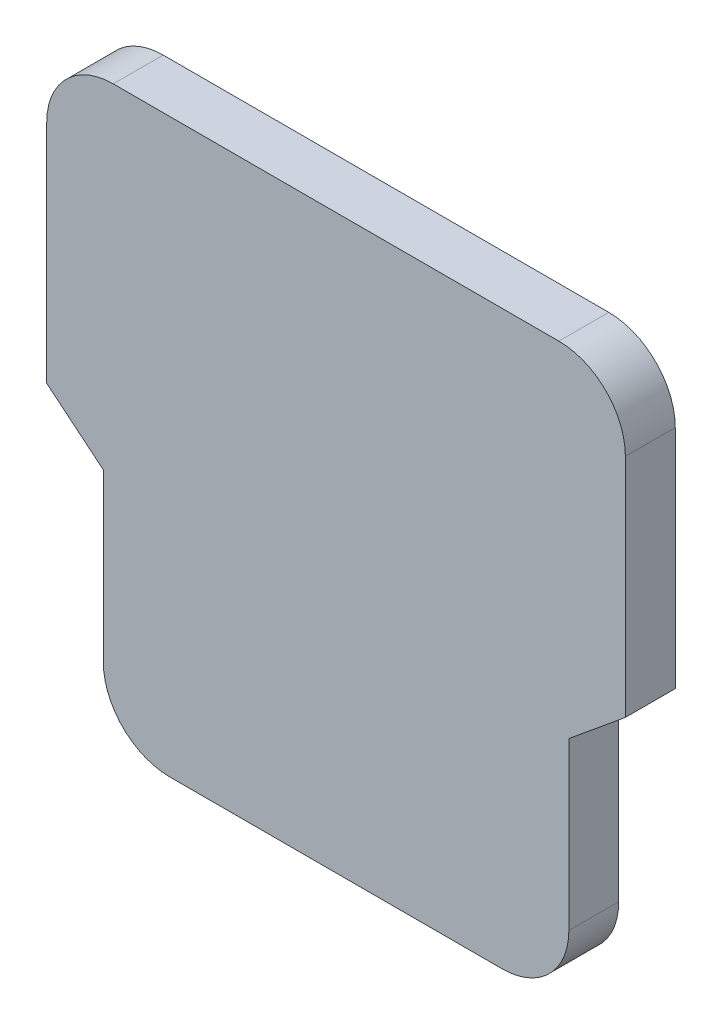
ISO-10303-21;
HEADER;
FILE_DESCRIPTION(('STEP AP214'),'2;1');
FILE_NAME('part.step','',(''),(''),'','','');
FILE_SCHEMA(('AUTOMOTIVE_DESIGN { 1 0 10303 214 1 1 1 1 }'));
ENDSEC;
DATA;
#1=APPLICATION_CONTEXT('core data for automotive mechanical design processes');
#2=APPLICATION_PROTOCOL_DEFINITION('international standard','automotive_design',2000,#1);
#3=PRODUCT_CONTEXT('',#1,'mechanical');
#4=PRODUCT('Part','Part','',(#3));
#5=PRODUCT_RELATED_PRODUCT_CATEGORY('part','',(#4));
#6=PRODUCT_DEFINITION_FORMATION('','',#4);
#7=PRODUCT_DEFINITION_CONTEXT('part definition',#1,'design');
#8=PRODUCT_DEFINITION('design','',#6,#7);
#9=PRODUCT_DEFINITION_SHAPE('','',#8);
#10=(LENGTH_UNIT() NAMED_UNIT(*) SI_UNIT(.MILLI.,.METRE.));
#11=(NAMED_UNIT(*) PLANE_ANGLE_UNIT() SI_UNIT($,.RADIAN.));
#12=(NAMED_UNIT(*) SI_UNIT($,.STERADIAN.) SOLID_ANGLE_UNIT());
#13=UNCERTAINTY_MEASURE_WITH_UNIT(LENGTH_MEASURE(1.E-05),#10,'distance_accuracy_value','');
#14=(GEOMETRIC_REPRESENTATION_CONTEXT(3) GLOBAL_UNCERTAINTY_ASSIGNED_CONTEXT((#13)) GLOBAL_UNIT_ASSIGNED_CONTEXT((#10,
#11,#12)) REPRESENTATION_CONTEXT('',''));
#15=CARTESIAN_POINT('',(0.,0.,0.));
#16=DIRECTION('',(0.,0.,1.));
#17=DIRECTION('',(1.,0.,0.));
#18=AXIS2_PLACEMENT_3D('',#15,#16,#17);
#19=CARTESIAN_POINT('',(-10.1546258608171,12.7923841059603,1.5));
#20=DIRECTION('',(1.,0.,0.));
#21=DIRECTION('',(0.,0.,-1.));
#22=AXIS2_PLACEMENT_3D('',#19,#20,#21);
#23=PLANE('',#22);
#24=DIRECTION('',(0.,-1.,0.));
#25=VECTOR('',#24,1.);
#26=CARTESIAN_POINT('',(-10.1546258608171,12.7923841059603,1.5));
#27=LINE('',#26,#25);
#28=CARTESIAN_POINT('',(-10.1546258608171,10.7923841059603,1.5));
#29=VERTEX_POINT('',#28);
#30=CARTESIAN_POINT('',(-10.1546258608171,3.99238410596026,1.5));
#31=VERTEX_POINT('',#30);
#32=EDGE_CURVE('E121',#29,#31,#27,.T.);
#33=ORIENTED_EDGE('',*,*,#32,.F.);
#34=DIRECTION('',(0.,0.,-1.));
#35=VECTOR('',#34,1.);
#36=CARTESIAN_POINT('',(-10.1546258608171,10.7923841059603,1.5));
#37=LINE('',#36,#35);
#38=CARTESIAN_POINT('',(-10.1546258608171,10.7923841059603,0.));
#39=VERTEX_POINT('',#38);
#40=EDGE_CURVE('E175',#29,#39,#37,.T.);
#41=ORIENTED_EDGE('',*,*,#40,.T.);
#42=DIRECTION('',(0.,-1.,0.));
#43=VECTOR('',#42,1.);
#44=CARTESIAN_POINT('',(-10.1546258608171,12.7923841059603,0.));
#45=LINE('',#44,#43);
#46=CARTESIAN_POINT('',(-10.1546258608171,3.99238410596026,0.));
#47=VERTEX_POINT('',#46);
#48=EDGE_CURVE('E147',#39,#47,#45,.T.);
#49=ORIENTED_EDGE('',*,*,#48,.T.);
#50=DIRECTION('',(0.,0.,-1.));
#51=VECTOR('',#50,1.);
#52=CARTESIAN_POINT('',(-10.1546258608171,3.99238410596026,1.5));
#53=LINE('',#52,#51);
#54=EDGE_CURVE('E140',#31,#47,#53,.T.);
#55=ORIENTED_EDGE('',*,*,#54,.F.);
#56=EDGE_LOOP('',(#33,#41,#49,#55));
#57=FACE_BOUND('',#56,.T.);
#58=ADVANCED_FACE('F32',(#57),#23,.F.);
#59=CARTESIAN_POINT('',(-8.45462586081714,2.59238410596026,1.5));
#60=DIRECTION('',(0.635707252861099,0.77193023561705,0.));
#61=DIRECTION('',(-0.77193023561705,0.6357072528611,0.));
#62=AXIS2_PLACEMENT_3D('',#59,#60,#61);
#63=PLANE('',#62);
#64=DIRECTION('',(0.77193023561705,-0.6357072528611,0.));
#65=VECTOR('',#64,1.);
#66=CARTESIAN_POINT('',(-8.45462586081714,2.59238410596026,0.));
#67=LINE('',#66,#65);
#68=CARTESIAN_POINT('',(-8.45462586081714,2.59238410596026,0.));
#69=VERTEX_POINT('',#68);
#70=EDGE_CURVE('E203',#47,#69,#67,.T.);
#71=ORIENTED_EDGE('',*,*,#70,.T.);
#72=DIRECTION('',(0.,0.,-1.));
#73=VECTOR('',#72,1.);
#74=CARTESIAN_POINT('',(-8.45462586081714,2.59238410596026,1.5));
#75=LINE('',#74,#73);
#76=CARTESIAN_POINT('',(-8.45462586081714,2.59238410596026,1.5));
#77=VERTEX_POINT('',#76);
#78=EDGE_CURVE('E142',#77,#69,#75,.T.);
#79=ORIENTED_EDGE('',*,*,#78,.F.);
#80=DIRECTION('',(0.77193023561705,-0.6357072528611,0.));
#81=VECTOR('',#80,1.);
#82=CARTESIAN_POINT('',(-8.45462586081714,2.59238410596026,1.5));
#83=LINE('',#82,#81);
#84=EDGE_CURVE('E126',#31,#77,#83,.T.);
#85=ORIENTED_EDGE('',*,*,#84,.F.);
#86=ORIENTED_EDGE('',*,*,#54,.T.);
#87=EDGE_LOOP('',(#71,#79,#85,#86));
#88=FACE_BOUND('',#87,.T.);
#89=ADVANCED_FACE('F139',(#88),#63,.F.);
#90=CARTESIAN_POINT('',(-8.45462586081714,-4.40761589403974,1.5));
#91=DIRECTION('',(1.,0.,0.));
#92=DIRECTION('',(0.,0.,-1.));
#93=AXIS2_PLACEMENT_3D('',#90,#91,#92);
#94=PLANE('',#93);
#95=DIRECTION('',(0.,-1.,0.));
#96=VECTOR('',#95,1.);
#97=CARTESIAN_POINT('',(-8.45462586081714,-4.40761589403974,0.));
#98=LINE('',#97,#96);
#99=CARTESIAN_POINT('',(-8.45462586081714,-2.40761589403974,0.));
#100=VERTEX_POINT('',#99);
#101=EDGE_CURVE('E185',#69,#100,#98,.T.);
#102=ORIENTED_EDGE('',*,*,#101,.T.);
#103=DIRECTION('',(0.,0.,-1.));
#104=VECTOR('',#103,1.);
#105=CARTESIAN_POINT('',(-8.45462586081714,-2.40761589403974,1.5));
#106=LINE('',#105,#104);
#107=CARTESIAN_POINT('',(-8.45462586081714,-2.40761589403974,1.5));
#108=VERTEX_POINT('',#107);
#109=EDGE_CURVE('E40',#100,#108,#106,.F.);
#110=ORIENTED_EDGE('',*,*,#109,.T.);
#111=DIRECTION('',(0.,-1.,0.));
#112=VECTOR('',#111,1.);
#113=CARTESIAN_POINT('',(-8.45462586081714,-4.40761589403974,1.5));
#114=LINE('',#113,#112);
#115=EDGE_CURVE('E144',#77,#108,#114,.T.);
#116=ORIENTED_EDGE('',*,*,#115,.F.);
#117=ORIENTED_EDGE('',*,*,#78,.T.);
#118=EDGE_LOOP('',(#102,#110,#116,#117));
#119=FACE_BOUND('',#118,.T.);
#120=ADVANCED_FACE('F183',(#119),#94,.F.);
#121=CARTESIAN_POINT('',(-8.45462586081714,-4.40761589403974,1.5));
#122=DIRECTION('',(0.,1.,0.));
#123=DIRECTION('',(0.,0.,1.));
#124=AXIS2_PLACEMENT_3D('',#121,#122,#123);
#125=PLANE('',#124);
#126=DIRECTION('',(1.,0.,0.));
#127=VECTOR('',#126,1.);
#128=CARTESIAN_POINT('',(-8.45462586081714,-4.40761589403974,1.5));
#129=LINE('',#128,#127);
#130=CARTESIAN_POINT('',(-6.45462586081714,-4.40761589403974,1.5));
#131=VERTEX_POINT('',#130);
#132=CARTESIAN_POINT('',(3.54537413918286,-4.40761589403974,1.5));
#133=VERTEX_POINT('',#132);
#134=EDGE_CURVE('E188',#131,#133,#129,.T.);
#135=ORIENTED_EDGE('',*,*,#134,.F.);
#136=DIRECTION('',(0.,0.,-1.));
#137=VECTOR('',#136,1.);
#138=CARTESIAN_POINT('',(-6.45462586081714,-4.40761589403974,1.5));
#139=LINE('',#138,#137);
#140=CARTESIAN_POINT('',(-6.45462586081714,-4.40761589403974,0.));
#141=VERTEX_POINT('',#140);
#142=EDGE_CURVE('E178',#131,#141,#139,.T.);
#143=ORIENTED_EDGE('',*,*,#142,.T.);
#144=DIRECTION('',(1.,0.,0.));
#145=VECTOR('',#144,1.);
#146=CARTESIAN_POINT('',(-8.45462586081714,-4.40761589403974,0.));
#147=LINE('',#146,#145);
#148=CARTESIAN_POINT('',(3.54537413918286,-4.40761589403974,0.));
#149=VERTEX_POINT('',#148);
#150=EDGE_CURVE('E194',#141,#149,#147,.T.);
#151=ORIENTED_EDGE('',*,*,#150,.T.);
#152=DIRECTION('',(0.,0.,-1.));
#153=VECTOR('',#152,1.);
#154=CARTESIAN_POINT('',(3.54537413918286,-4.40761589403974,1.5));
#155=LINE('',#154,#153);
#156=EDGE_CURVE('E55',#149,#133,#155,.F.);
#157=ORIENTED_EDGE('',*,*,#156,.T.);
#158=EDGE_LOOP('',(#135,#143,#151,#157));
#159=FACE_BOUND('',#158,.T.);
#160=ADVANCED_FACE('F193',(#159),#125,.F.);
#161=CARTESIAN_POINT('',(5.54537413918286,-4.40761589403974,1.5));
#162=DIRECTION('',(-1.,0.,0.));
#163=DIRECTION('',(0.,-1.,0.));
#164=AXIS2_PLACEMENT_3D('',#161,#162,#163);
#165=PLANE('',#164);
#166=DIRECTION('',(0.,1.,0.));
#167=VECTOR('',#166,1.);
#168=CARTESIAN_POINT('',(5.54537413918286,-4.40761589403974,1.5));
#169=LINE('',#168,#167);
#170=CARTESIAN_POINT('',(5.54537413918286,-2.40761589403974,1.5));
#171=VERTEX_POINT('',#170);
#172=CARTESIAN_POINT('',(5.54537413918286,2.59238410596026,1.5));
#173=VERTEX_POINT('',#172);
#174=EDGE_CURVE('E310',#171,#173,#169,.T.);
#175=ORIENTED_EDGE('',*,*,#174,.F.);
#176=DIRECTION('',(0.,0.,-1.));
#177=VECTOR('',#176,1.);
#178=CARTESIAN_POINT('',(5.54537413918286,-2.40761589403974,1.5));
#179=LINE('',#178,#177);
#180=CARTESIAN_POINT('',(5.54537413918286,-2.40761589403974,0.));
#181=VERTEX_POINT('',#180);
#182=EDGE_CURVE('E11',#171,#181,#179,.T.);
#183=ORIENTED_EDGE('',*,*,#182,.T.);
#184=DIRECTION('',(0.,1.,0.));
#185=VECTOR('',#184,1.);
#186=CARTESIAN_POINT('',(5.54537413918286,-4.40761589403974,0.));
#187=LINE('',#186,#185);
#188=CARTESIAN_POINT('',(5.54537413918286,2.59238410596026,0.));
#189=VERTEX_POINT('',#188);
#190=EDGE_CURVE('E199',#181,#189,#187,.T.);
#191=ORIENTED_EDGE('',*,*,#190,.T.);
#192=DIRECTION('',(0.,0.,-1.));
#193=VECTOR('',#192,1.);
#194=CARTESIAN_POINT('',(5.54537413918286,2.59238410596026,1.5));
#195=LINE('',#194,#193);
#196=EDGE_CURVE('E153',#173,#189,#195,.T.);
#197=ORIENTED_EDGE('',*,*,#196,.F.);
#198=EDGE_LOOP('',(#175,#183,#191,#197));
#199=FACE_BOUND('',#198,.T.);
#200=ADVANCED_FACE('F263',(#199),#165,.F.);
#201=CARTESIAN_POINT('',(5.54537413918286,2.59238410596026,1.5));
#202=DIRECTION('',(-0.6357072528611,0.771930235617049,0.));
#203=DIRECTION('',(-0.77193023561705,-0.6357072528611,0.));
#204=AXIS2_PLACEMENT_3D('',#201,#202,#203);
#205=PLANE('',#204);
#206=DIRECTION('',(0.771930235617049,0.6357072528611,0.));
#207=VECTOR('',#206,1.);
#208=CARTESIAN_POINT('',(5.54537413918286,2.59238410596026,0.));
#209=LINE('',#208,#207);
#210=CARTESIAN_POINT('',(7.24537413918286,3.99238410596026,0.));
#211=VERTEX_POINT('',#210);
#212=EDGE_CURVE('E201',#189,#211,#209,.T.);
#213=ORIENTED_EDGE('',*,*,#212,.T.);
#214=DIRECTION('',(0.,0.,-1.));
#215=VECTOR('',#214,1.);
#216=CARTESIAN_POINT('',(7.24537413918286,3.99238410596026,1.5));
#217=LINE('',#216,#215);
#218=CARTESIAN_POINT('',(7.24537413918286,3.99238410596026,1.5));
#219=VERTEX_POINT('',#218);
#220=EDGE_CURVE('E213',#219,#211,#217,.T.);
#221=ORIENTED_EDGE('',*,*,#220,.F.);
#222=DIRECTION('',(0.771930235617049,0.6357072528611,0.));
#223=VECTOR('',#222,1.);
#224=CARTESIAN_POINT('',(5.54537413918286,2.59238410596026,1.5));
#225=LINE('',#224,#223);
#226=EDGE_CURVE('E223',#173,#219,#225,.T.);
#227=ORIENTED_EDGE('',*,*,#226,.F.);
#228=ORIENTED_EDGE('',*,*,#196,.T.);
#229=EDGE_LOOP('',(#213,#221,#227,#228));
#230=FACE_BOUND('',#229,.T.);
#231=ADVANCED_FACE('F221',(#230),#205,.F.);
#232=CARTESIAN_POINT('',(7.24537413918286,12.7923841059603,1.5));
#233=DIRECTION('',(-1.,0.,0.));
#234=DIRECTION('',(0.,-1.,0.));
#235=AXIS2_PLACEMENT_3D('',#232,#233,#234);
#236=PLANE('',#235);
#237=DIRECTION('',(0.,1.,0.));
#238=VECTOR('',#237,1.);
#239=CARTESIAN_POINT('',(7.24537413918286,12.7923841059603,0.));
#240=LINE('',#239,#238);
#241=CARTESIAN_POINT('',(7.24537413918286,10.7923841059603,0.));
#242=VERTEX_POINT('',#241);
#243=EDGE_CURVE('E208',#211,#242,#240,.T.);
#244=ORIENTED_EDGE('',*,*,#243,.T.);
#245=DIRECTION('',(0.,0.,-1.));
#246=VECTOR('',#245,1.);
#247=CARTESIAN_POINT('',(7.24537413918286,10.7923841059603,1.5));
#248=LINE('',#247,#246);
#249=CARTESIAN_POINT('',(7.24537413918286,10.7923841059603,1.5));
#250=VERTEX_POINT('',#249);
#251=EDGE_CURVE('E167',#242,#250,#248,.F.);
#252=ORIENTED_EDGE('',*,*,#251,.T.);
#253=DIRECTION('',(0.,1.,0.));
#254=VECTOR('',#253,1.);
#255=CARTESIAN_POINT('',(7.24537413918286,12.7923841059603,1.5));
#256=LINE('',#255,#254);
#257=EDGE_CURVE('E235',#219,#250,#256,.T.);
#258=ORIENTED_EDGE('',*,*,#257,.F.);
#259=ORIENTED_EDGE('',*,*,#220,.T.);
#260=EDGE_LOOP('',(#244,#252,#258,#259));
#261=FACE_BOUND('',#260,.T.);
#262=ADVANCED_FACE('F228',(#261),#236,.F.);
#263=CARTESIAN_POINT('',(-10.1546258608171,12.7923841059603,1.5));
#264=DIRECTION('',(0.,-1.,0.));
#265=DIRECTION('',(0.,0.,-1.));
#266=AXIS2_PLACEMENT_3D('',#263,#264,#265);
#267=PLANE('',#266);
#268=DIRECTION('',(-1.,0.,0.));
#269=VECTOR('',#268,1.);
#270=CARTESIAN_POINT('',(-10.1546258608171,12.7923841059603,1.5));
#271=LINE('',#270,#269);
#272=CARTESIAN_POINT('',(5.24537413918286,12.7923841059603,1.5));
#273=VERTEX_POINT('',#272);
#274=CARTESIAN_POINT('',(-8.15462586081714,12.7923841059603,1.5));
#275=VERTEX_POINT('',#274);
#276=EDGE_CURVE('E215',#273,#275,#271,.T.);
#277=ORIENTED_EDGE('',*,*,#276,.F.);
#278=DIRECTION('',(0.,0.,-1.));
#279=VECTOR('',#278,1.);
#280=CARTESIAN_POINT('',(5.24537413918286,12.7923841059603,1.5));
#281=LINE('',#280,#279);
#282=CARTESIAN_POINT('',(5.24537413918286,12.7923841059603,0.));
#283=VERTEX_POINT('',#282);
#284=EDGE_CURVE('E151',#273,#283,#281,.T.);
#285=ORIENTED_EDGE('',*,*,#284,.T.);
#286=DIRECTION('',(-1.,0.,0.));
#287=VECTOR('',#286,1.);
#288=CARTESIAN_POINT('',(-10.1546258608171,12.7923841059603,0.));
#289=LINE('',#288,#287);
#290=CARTESIAN_POINT('',(-8.15462586081714,12.7923841059603,0.));
#291=VERTEX_POINT('',#290);
#292=EDGE_CURVE('E135',#283,#291,#289,.T.);
#293=ORIENTED_EDGE('',*,*,#292,.T.);
#294=DIRECTION('',(0.,0.,-1.));
#295=VECTOR('',#294,1.);
#296=CARTESIAN_POINT('',(-8.15462586081714,12.7923841059603,1.5));
#297=LINE('',#296,#295);
#298=EDGE_CURVE('E149',#291,#275,#297,.F.);
#299=ORIENTED_EDGE('',*,*,#298,.T.);
#300=EDGE_LOOP('',(#277,#285,#293,#299));
#301=FACE_BOUND('',#300,.T.);
#302=ADVANCED_FACE('F237',(#301),#267,.F.);
#303=CARTESIAN_POINT('',(0.,0.,1.5));
#304=DIRECTION('',(0.,0.,1.));
#305=DIRECTION('',(1.,0.,0.));
#306=AXIS2_PLACEMENT_3D('',#303,#304,#305);
#307=PLANE('',#306);
#308=ORIENTED_EDGE('',*,*,#257,.T.);
#309=CARTESIAN_POINT('',(5.24537413918286,10.7923841059603,1.5));
#310=DIRECTION('',(0.,0.,1.));
#311=DIRECTION('',(1.,0.,0.));
#312=AXIS2_PLACEMENT_3D('',#309,#310,#311);
#313=CIRCLE('',#312,2.);
#314=EDGE_CURVE('E173',#250,#273,#313,.T.);
#315=ORIENTED_EDGE('',*,*,#314,.T.);
#316=ORIENTED_EDGE('',*,*,#276,.T.);
#317=CARTESIAN_POINT('',(-8.15462586081714,10.7923841059603,1.5));
#318=DIRECTION('',(0.,0.,1.));
#319=DIRECTION('',(1.,0.,0.));
#320=AXIS2_PLACEMENT_3D('',#317,#318,#319);
#321=CIRCLE('',#320,2.);
#322=EDGE_CURVE('E130',#275,#29,#321,.T.);
#323=ORIENTED_EDGE('',*,*,#322,.T.);
#324=ORIENTED_EDGE('',*,*,#32,.T.);
#325=ORIENTED_EDGE('',*,*,#84,.T.);
#326=ORIENTED_EDGE('',*,*,#115,.T.);
#327=CARTESIAN_POINT('',(-6.45462586081714,-2.40761589403974,1.5));
#328=DIRECTION('',(0.,0.,1.));
#329=DIRECTION('',(1.,0.,0.));
#330=AXIS2_PLACEMENT_3D('',#327,#328,#329);
#331=CIRCLE('',#330,2.);
#332=EDGE_CURVE('E170',#108,#131,#331,.T.);
#333=ORIENTED_EDGE('',*,*,#332,.T.);
#334=ORIENTED_EDGE('',*,*,#134,.T.);
#335=CARTESIAN_POINT('',(3.54537413918286,-2.40761589403974,1.5));
#336=DIRECTION('',(0.,0.,1.));
#337=DIRECTION('',(1.,0.,0.));
#338=AXIS2_PLACEMENT_3D('',#335,#336,#337);
#339=CIRCLE('',#338,2.);
#340=EDGE_CURVE('E47',#133,#171,#339,.T.);
#341=ORIENTED_EDGE('',*,*,#340,.T.);
#342=ORIENTED_EDGE('',*,*,#174,.T.);
#343=ORIENTED_EDGE('',*,*,#226,.T.);
#344=EDGE_LOOP('',(#308,#315,#316,#323,#324,#325,#326,#333,#334,#341,#342,#343));
#345=FACE_BOUND('',#344,.T.);
#346=ADVANCED_FACE('F124',(#345),#307,.T.);
#347=CARTESIAN_POINT('',(0.,0.,0.));
#348=DIRECTION('',(0.,0.,1.));
#349=DIRECTION('',(1.,0.,0.));
#350=AXIS2_PLACEMENT_3D('',#347,#348,#349);
#351=PLANE('',#350);
#352=ORIENTED_EDGE('',*,*,#292,.F.);
#353=CARTESIAN_POINT('',(5.24537413918286,10.7923841059603,0.));
#354=DIRECTION('',(0.,0.,1.));
#355=DIRECTION('',(1.,0.,0.));
#356=AXIS2_PLACEMENT_3D('',#353,#354,#355);
#357=CIRCLE('',#356,2.);
#358=EDGE_CURVE('E165',#283,#242,#357,.F.);
#359=ORIENTED_EDGE('',*,*,#358,.T.);
#360=ORIENTED_EDGE('',*,*,#243,.F.);
#361=ORIENTED_EDGE('',*,*,#212,.F.);
#362=ORIENTED_EDGE('',*,*,#190,.F.);
#363=CARTESIAN_POINT('',(3.54537413918286,-2.40761589403974,0.));
#364=DIRECTION('',(0.,0.,1.));
#365=DIRECTION('',(1.,0.,0.));
#366=AXIS2_PLACEMENT_3D('',#363,#364,#365);
#367=CIRCLE('',#366,2.);
#368=EDGE_CURVE('E159',#181,#149,#367,.F.);
#369=ORIENTED_EDGE('',*,*,#368,.T.);
#370=ORIENTED_EDGE('',*,*,#150,.F.);
#371=CARTESIAN_POINT('',(-6.45462586081714,-2.40761589403974,0.));
#372=DIRECTION('',(0.,0.,1.));
#373=DIRECTION('',(1.,0.,0.));
#374=AXIS2_PLACEMENT_3D('',#371,#372,#373);
#375=CIRCLE('',#374,2.);
#376=EDGE_CURVE('E161',#141,#100,#375,.F.);
#377=ORIENTED_EDGE('',*,*,#376,.T.);
#378=ORIENTED_EDGE('',*,*,#101,.F.);
#379=ORIENTED_EDGE('',*,*,#70,.F.);
#380=ORIENTED_EDGE('',*,*,#48,.F.);
#381=CARTESIAN_POINT('',(-8.15462586081714,10.7923841059603,0.));
#382=DIRECTION('',(0.,0.,1.));
#383=DIRECTION('',(1.,0.,0.));
#384=AXIS2_PLACEMENT_3D('',#381,#382,#383);
#385=CIRCLE('',#384,2.);
#386=EDGE_CURVE('E163',#39,#291,#385,.F.);
#387=ORIENTED_EDGE('',*,*,#386,.T.);
#388=EDGE_LOOP('',(#352,#359,#360,#361,#362,#369,#370,#377,#378,#379,#380,#387));
#389=FACE_BOUND('',#388,.T.);
#390=ADVANCED_FACE('F197',(#389),#351,.F.);
#391=CARTESIAN_POINT('',(5.24537413918286,10.7923841059603,1.5));
#392=DIRECTION('',(0.,0.,-1.));
#393=DIRECTION('',(-1.,0.,0.));
#394=AXIS2_PLACEMENT_3D('',#391,#392,#393);
#395=CYLINDRICAL_SURFACE('',#394,2.);
#396=ORIENTED_EDGE('',*,*,#314,.F.);
#397=ORIENTED_EDGE('',*,*,#251,.F.);
#398=ORIENTED_EDGE('',*,*,#358,.F.);
#399=ORIENTED_EDGE('',*,*,#284,.F.);
#400=EDGE_LOOP('',(#396,#397,#398,#399));
#401=FACE_BOUND('',#400,.T.);
#402=ADVANCED_FACE('F232',(#401),#395,.T.);
#403=CARTESIAN_POINT('',(-8.15462586081714,10.7923841059603,1.5));
#404=DIRECTION('',(0.,0.,-1.));
#405=DIRECTION('',(-1.,0.,0.));
#406=AXIS2_PLACEMENT_3D('',#403,#404,#405);
#407=CYLINDRICAL_SURFACE('',#406,2.);
#408=ORIENTED_EDGE('',*,*,#322,.F.);
#409=ORIENTED_EDGE('',*,*,#298,.F.);
#410=ORIENTED_EDGE('',*,*,#386,.F.);
#411=ORIENTED_EDGE('',*,*,#40,.F.);
#412=EDGE_LOOP('',(#408,#409,#410,#411));
#413=FACE_BOUND('',#412,.T.);
#414=ADVANCED_FACE('F244',(#413),#407,.T.);
#415=CARTESIAN_POINT('',(-6.45462586081714,-2.40761589403974,1.5));
#416=DIRECTION('',(0.,0.,-1.));
#417=DIRECTION('',(-1.,0.,0.));
#418=AXIS2_PLACEMENT_3D('',#415,#416,#417);
#419=CYLINDRICAL_SURFACE('',#418,2.);
#420=ORIENTED_EDGE('',*,*,#332,.F.);
#421=ORIENTED_EDGE('',*,*,#109,.F.);
#422=ORIENTED_EDGE('',*,*,#376,.F.);
#423=ORIENTED_EDGE('',*,*,#142,.F.);
#424=EDGE_LOOP('',(#420,#421,#422,#423));
#425=FACE_BOUND('',#424,.T.);
#426=ADVANCED_FACE('F191',(#425),#419,.T.);
#427=CARTESIAN_POINT('',(3.54537413918286,-2.40761589403974,1.5));
#428=DIRECTION('',(0.,0.,-1.));
#429=DIRECTION('',(-1.,0.,0.));
#430=AXIS2_PLACEMENT_3D('',#427,#428,#429);
#431=CYLINDRICAL_SURFACE('',#430,2.);
#432=ORIENTED_EDGE('',*,*,#340,.F.);
#433=ORIENTED_EDGE('',*,*,#156,.F.);
#434=ORIENTED_EDGE('',*,*,#368,.F.);
#435=ORIENTED_EDGE('',*,*,#182,.F.);
#436=EDGE_LOOP('',(#432,#433,#434,#435));
#437=FACE_BOUND('',#436,.T.);
#438=ADVANCED_FACE('F34',(#437),#431,.T.);
#439=CLOSED_SHELL('',(#58,#89,#120,#160,#200,#231,#262,#302,#346,#390,#402,#414,#426,#438));
#440=MANIFOLD_SOLID_BREP('B2',#439);
#441=ADVANCED_BREP_SHAPE_REPRESENTATION('',(#18,#440),#14);
#442=SHAPE_DEFINITION_REPRESENTATION(#9,#441);
ENDSEC;
END-ISO-10303-21;
